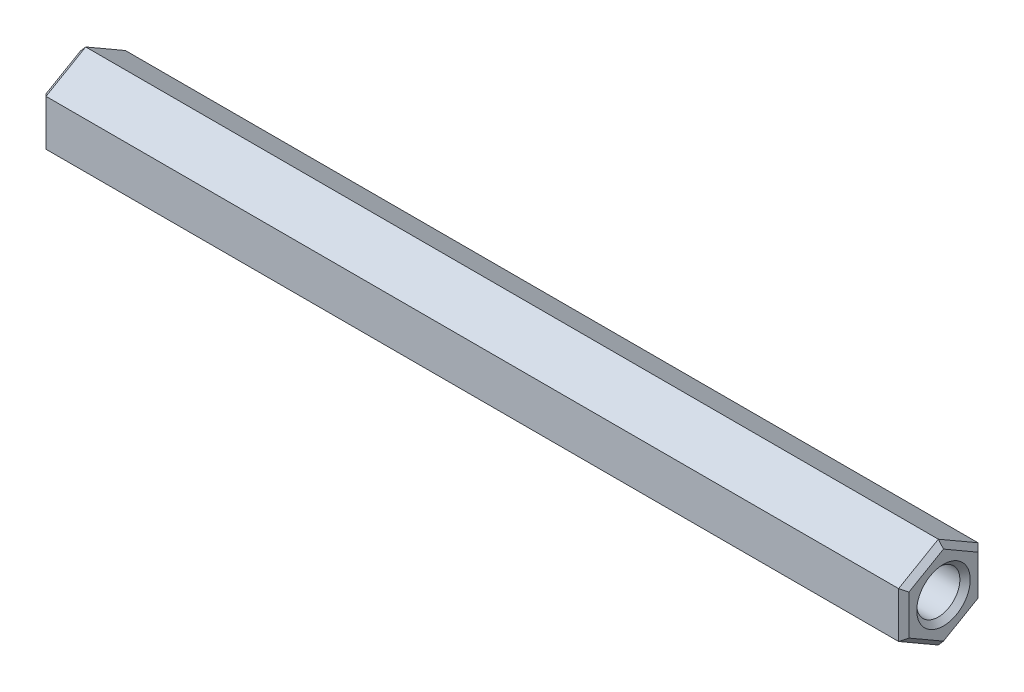
ISO-10303-21;
HEADER;
FILE_DESCRIPTION(('STEP AP214'),'2;1');
FILE_NAME('part.step','',(''),(''),'','','');
FILE_SCHEMA(('AUTOMOTIVE_DESIGN { 1 0 10303 214 1 1 1 1 }'));
ENDSEC;
DATA;
#1=APPLICATION_CONTEXT('core data for automotive mechanical design processes');
#2=APPLICATION_PROTOCOL_DEFINITION('international standard','automotive_design',2000,#1);
#3=PRODUCT_CONTEXT('',#1,'mechanical');
#4=PRODUCT('Part','Part','',(#3));
#5=PRODUCT_RELATED_PRODUCT_CATEGORY('part','',(#4));
#6=PRODUCT_DEFINITION_FORMATION('','',#4);
#7=PRODUCT_DEFINITION_CONTEXT('part definition',#1,'design');
#8=PRODUCT_DEFINITION('design','',#6,#7);
#9=PRODUCT_DEFINITION_SHAPE('','',#8);
#10=(LENGTH_UNIT() NAMED_UNIT(*) SI_UNIT(.MILLI.,.METRE.));
#11=(NAMED_UNIT(*) PLANE_ANGLE_UNIT() SI_UNIT($,.RADIAN.));
#12=(NAMED_UNIT(*) SI_UNIT($,.STERADIAN.) SOLID_ANGLE_UNIT());
#13=UNCERTAINTY_MEASURE_WITH_UNIT(LENGTH_MEASURE(1.E-05),#10,'distance_accuracy_value','');
#14=(GEOMETRIC_REPRESENTATION_CONTEXT(3) GLOBAL_UNCERTAINTY_ASSIGNED_CONTEXT((#13)) GLOBAL_UNIT_ASSIGNED_CONTEXT((#10,
#11,#12)) REPRESENTATION_CONTEXT('',''));
#15=CARTESIAN_POINT('',(0.,0.,0.));
#16=DIRECTION('',(0.,0.,1.));
#17=DIRECTION('',(1.,0.,0.));
#18=AXIS2_PLACEMENT_3D('',#15,#16,#17);
#19=CARTESIAN_POINT('',(50.,0.,0.));
#20=DIRECTION('',(1.,0.,0.));
#21=DIRECTION('',(0.,0.,-1.));
#22=AXIS2_PLACEMENT_3D('',#19,#20,#21);
#23=PLANE('',#22);
#24=CARTESIAN_POINT('',(50.,0.,0.));
#25=DIRECTION('',(1.,0.,0.));
#26=DIRECTION('',(0.,0.,-1.));
#27=AXIS2_PLACEMENT_3D('',#24,#25,#26);
#28=CIRCLE('',#27,1.55000000000001);
#29=CARTESIAN_POINT('',(50.,0.,-1.55000000000001));
#30=VERTEX_POINT('',#29);
#31=EDGE_CURVE('E11',#30,#30,#28,.F.);
#32=ORIENTED_EDGE('',*,*,#31,.T.);
#33=EDGE_LOOP('',(#32));
#34=FACE_BOUND('',#33,.T.);
#35=DIRECTION('',(0.,0.5,-0.866025403784439));
#36=VECTOR('',#35,1.);
#37=CARTESIAN_POINT('',(50.,-1.0680979980008,-2.14999999999999));
#38=LINE('',#37,#36);
#39=CARTESIAN_POINT('',(50.,-2.30940107675849,0.));
#40=VERTEX_POINT('',#39);
#41=CARTESIAN_POINT('',(50.,-1.15470053837924,-1.99999999999999));
#42=VERTEX_POINT('',#41);
#43=EDGE_CURVE('E61',#40,#42,#38,.T.);
#44=ORIENTED_EDGE('',*,*,#43,.T.);
#45=DIRECTION('',(0.,1.,0.));
#46=VECTOR('',#45,1.);
#47=CARTESIAN_POINT('',(50.,1.32790561913614,-1.99999999999999));
#48=LINE('',#47,#46);
#49=CARTESIAN_POINT('',(50.,1.15470053837925,-1.99999999999999));
#50=VERTEX_POINT('',#49);
#51=EDGE_CURVE('E53',#42,#50,#48,.T.);
#52=ORIENTED_EDGE('',*,*,#51,.T.);
#53=DIRECTION('',(0.,0.5,0.866025403784439));
#54=VECTOR('',#53,1.);
#55=CARTESIAN_POINT('',(50.,2.39600361713694,0.150000000000006));
#56=LINE('',#55,#54);
#57=CARTESIAN_POINT('',(50.,2.30940107675849,0.));
#58=VERTEX_POINT('',#57);
#59=EDGE_CURVE('E200',#50,#58,#56,.T.);
#60=ORIENTED_EDGE('',*,*,#59,.T.);
#61=DIRECTION('',(0.,-0.5,0.866025403784439));
#62=VECTOR('',#61,1.);
#63=CARTESIAN_POINT('',(50.,1.0680979980008,2.14999999999999));
#64=LINE('',#63,#62);
#65=CARTESIAN_POINT('',(50.,1.15470053837925,1.99999999999999));
#66=VERTEX_POINT('',#65);
#67=EDGE_CURVE('E202',#58,#66,#64,.T.);
#68=ORIENTED_EDGE('',*,*,#67,.T.);
#69=DIRECTION('',(0.,-1.,0.));
#70=VECTOR('',#69,1.);
#71=CARTESIAN_POINT('',(50.,-1.32790561913614,1.99999999999999));
#72=LINE('',#71,#70);
#73=CARTESIAN_POINT('',(50.,-1.15470053837925,1.99999999999999));
#74=VERTEX_POINT('',#73);
#75=EDGE_CURVE('E204',#66,#74,#72,.T.);
#76=ORIENTED_EDGE('',*,*,#75,.T.);
#77=DIRECTION('',(0.,-0.5,-0.866025403784439));
#78=VECTOR('',#77,1.);
#79=CARTESIAN_POINT('',(50.,-2.39600361713694,-0.150000000000004));
#80=LINE('',#79,#78);
#81=EDGE_CURVE('E66',#74,#40,#80,.T.);
#82=ORIENTED_EDGE('',*,*,#81,.T.);
#83=EDGE_LOOP('',(#44,#52,#60,#68,#76,#82));
#84=FACE_BOUND('',#83,.T.);
#85=ADVANCED_FACE('F43',(#34,#84),#23,.T.);
#86=CARTESIAN_POINT('',(0.,0.,0.));
#87=DIRECTION('',(1.,0.,0.));
#88=DIRECTION('',(0.,0.,-1.));
#89=AXIS2_PLACEMENT_3D('',#86,#87,#88);
#90=PLANE('',#89);
#91=CARTESIAN_POINT('',(0.,0.,0.));
#92=DIRECTION('',(1.,0.,0.));
#93=DIRECTION('',(0.,0.,-1.));
#94=AXIS2_PLACEMENT_3D('',#91,#92,#93);
#95=CIRCLE('',#94,1.55);
#96=CARTESIAN_POINT('',(0.,0.,-1.55));
#97=VERTEX_POINT('',#96);
#98=EDGE_CURVE('E162',#97,#97,#95,.T.);
#99=ORIENTED_EDGE('',*,*,#98,.T.);
#100=EDGE_LOOP('',(#99));
#101=FACE_BOUND('',#100,.T.);
#102=DIRECTION('',(0.,1.,0.));
#103=VECTOR('',#102,1.);
#104=CARTESIAN_POINT('',(0.,0.,2.00000000000001));
#105=LINE('',#104,#103);
#106=CARTESIAN_POINT('',(0.,-1.15470053837926,2.00000000000001));
#107=VERTEX_POINT('',#106);
#108=CARTESIAN_POINT('',(0.,1.15470053837926,2.00000000000001));
#109=VERTEX_POINT('',#108);
#110=EDGE_CURVE('E161',#107,#109,#105,.T.);
#111=ORIENTED_EDGE('',*,*,#110,.T.);
#112=DIRECTION('',(0.,0.5,-0.866025403784439));
#113=VECTOR('',#112,1.);
#114=CARTESIAN_POINT('',(0.,1.73205080756888,1.));
#115=LINE('',#114,#113);
#116=CARTESIAN_POINT('',(0.,2.30940107675851,0.));
#117=VERTEX_POINT('',#116);
#118=EDGE_CURVE('E140',#109,#117,#115,.T.);
#119=ORIENTED_EDGE('',*,*,#118,.T.);
#120=DIRECTION('',(0.,-0.5,-0.866025403784439));
#121=VECTOR('',#120,1.);
#122=CARTESIAN_POINT('',(0.,1.73205080756888,-1.));
#123=LINE('',#122,#121);
#124=CARTESIAN_POINT('',(0.,1.15470053837926,-2.00000000000001));
#125=VERTEX_POINT('',#124);
#126=EDGE_CURVE('E150',#117,#125,#123,.T.);
#127=ORIENTED_EDGE('',*,*,#126,.T.);
#128=DIRECTION('',(0.,-1.,0.));
#129=VECTOR('',#128,1.);
#130=CARTESIAN_POINT('',(0.,0.,-2.00000000000001));
#131=LINE('',#130,#129);
#132=CARTESIAN_POINT('',(0.,-1.15470053837925,-2.00000000000001));
#133=VERTEX_POINT('',#132);
#134=EDGE_CURVE('E156',#125,#133,#131,.T.);
#135=ORIENTED_EDGE('',*,*,#134,.T.);
#136=DIRECTION('',(0.,-0.5,0.866025403784439));
#137=VECTOR('',#136,1.);
#138=CARTESIAN_POINT('',(0.,-1.73205080756888,-1.));
#139=LINE('',#138,#137);
#140=CARTESIAN_POINT('',(0.,-2.30940107675851,0.));
#141=VERTEX_POINT('',#140);
#142=EDGE_CURVE('E262',#133,#141,#139,.T.);
#143=ORIENTED_EDGE('',*,*,#142,.T.);
#144=DIRECTION('',(0.,0.5,0.866025403784439));
#145=VECTOR('',#144,1.);
#146=CARTESIAN_POINT('',(0.,-1.73205080756888,1.));
#147=LINE('',#146,#145);
#148=EDGE_CURVE('E167',#141,#107,#147,.T.);
#149=ORIENTED_EDGE('',*,*,#148,.T.);
#150=EDGE_LOOP('',(#111,#119,#127,#135,#143,#149));
#151=FACE_BOUND('',#150,.T.);
#152=ADVANCED_FACE('F159',(#101,#151),#90,.F.);
#153=CARTESIAN_POINT('',(50.,1.32790561913614,-2.3));
#154=DIRECTION('',(0.,-0.866025403784439,0.5));
#155=DIRECTION('',(0.,-0.5,-0.866025403784439));
#156=AXIS2_PLACEMENT_3D('',#153,#154,#155);
#157=PLANE('',#156);
#158=DIRECTION('',(-1.,0.,0.));
#159=VECTOR('',#158,1.);
#160=CARTESIAN_POINT('',(50.,1.32790561913614,-2.3));
#161=LINE('',#160,#159);
#162=CARTESIAN_POINT('',(49.7,1.32790561913614,-2.3));
#163=VERTEX_POINT('',#162);
#164=CARTESIAN_POINT('',(0.299999999999988,1.32790561913614,-2.3));
#165=VERTEX_POINT('',#164);
#166=EDGE_CURVE('E219',#163,#165,#161,.T.);
#167=ORIENTED_EDGE('',*,*,#166,.T.);
#168=DIRECTION('',(0.,0.5,0.866025403784439));
#169=VECTOR('',#168,1.);
#170=CARTESIAN_POINT('',(0.299999999999988,1.32790561913614,-2.3));
#171=LINE('',#170,#169);
#172=CARTESIAN_POINT('',(0.299999999999988,2.65581123827228,0.));
#173=VERTEX_POINT('',#172);
#174=EDGE_CURVE('E198',#165,#173,#171,.T.);
#175=ORIENTED_EDGE('',*,*,#174,.T.);
#176=DIRECTION('',(-1.,0.,0.));
#177=VECTOR('',#176,1.);
#178=CARTESIAN_POINT('',(50.,2.65581123827228,0.));
#179=LINE('',#178,#177);
#180=CARTESIAN_POINT('',(49.7,2.65581123827228,0.));
#181=VERTEX_POINT('',#180);
#182=EDGE_CURVE('E157',#181,#173,#179,.T.);
#183=ORIENTED_EDGE('',*,*,#182,.F.);
#184=DIRECTION('',(0.,-0.5,-0.866025403784439));
#185=VECTOR('',#184,1.);
#186=CARTESIAN_POINT('',(49.7,1.32790561913614,-2.3));
#187=LINE('',#186,#185);
#188=EDGE_CURVE('E196',#181,#163,#187,.T.);
#189=ORIENTED_EDGE('',*,*,#188,.T.);
#190=EDGE_LOOP('',(#167,#175,#183,#189));
#191=FACE_BOUND('',#190,.T.);
#192=ADVANCED_FACE('F286',(#191),#157,.F.);
#193=CARTESIAN_POINT('',(50.,2.65581123827228,0.));
#194=DIRECTION('',(0.,-0.866025403784438,-0.5));
#195=DIRECTION('',(0.,0.5,-0.866025403784438));
#196=AXIS2_PLACEMENT_3D('',#193,#194,#195);
#197=PLANE('',#196);
#198=ORIENTED_EDGE('',*,*,#182,.T.);
#199=DIRECTION('',(0.,-0.5,0.866025403784438));
#200=VECTOR('',#199,1.);
#201=CARTESIAN_POINT('',(0.299999999999988,2.65581123827228,0.));
#202=LINE('',#201,#200);
#203=CARTESIAN_POINT('',(0.299999999999988,1.32790561913614,2.3));
#204=VERTEX_POINT('',#203);
#205=EDGE_CURVE('E143',#173,#204,#202,.T.);
#206=ORIENTED_EDGE('',*,*,#205,.T.);
#207=DIRECTION('',(-1.,0.,0.));
#208=VECTOR('',#207,1.);
#209=CARTESIAN_POINT('',(50.,1.32790561913614,2.3));
#210=LINE('',#209,#208);
#211=CARTESIAN_POINT('',(49.7,1.32790561913614,2.3));
#212=VERTEX_POINT('',#211);
#213=EDGE_CURVE('E248',#212,#204,#210,.T.);
#214=ORIENTED_EDGE('',*,*,#213,.F.);
#215=DIRECTION('',(0.,0.5,-0.866025403784438));
#216=VECTOR('',#215,1.);
#217=CARTESIAN_POINT('',(49.7,2.65581123827228,0.));
#218=LINE('',#217,#216);
#219=EDGE_CURVE('E176',#212,#181,#218,.T.);
#220=ORIENTED_EDGE('',*,*,#219,.T.);
#221=EDGE_LOOP('',(#198,#206,#214,#220));
#222=FACE_BOUND('',#221,.T.);
#223=ADVANCED_FACE('F253',(#222),#197,.F.);
#224=CARTESIAN_POINT('',(50.,1.32790561913614,2.3));
#225=DIRECTION('',(0.,0.,-1.));
#226=DIRECTION('',(0.,1.,0.));
#227=AXIS2_PLACEMENT_3D('',#224,#225,#226);
#228=PLANE('',#227);
#229=ORIENTED_EDGE('',*,*,#213,.T.);
#230=DIRECTION('',(0.,-1.,0.));
#231=VECTOR('',#230,1.);
#232=CARTESIAN_POINT('',(0.299999999999988,1.32790561913614,2.3));
#233=LINE('',#232,#231);
#234=CARTESIAN_POINT('',(0.299999999999988,-1.32790561913614,2.3));
#235=VERTEX_POINT('',#234);
#236=EDGE_CURVE('E181',#204,#235,#233,.T.);
#237=ORIENTED_EDGE('',*,*,#236,.T.);
#238=DIRECTION('',(-1.,0.,0.));
#239=VECTOR('',#238,1.);
#240=CARTESIAN_POINT('',(50.,-1.32790561913614,2.3));
#241=LINE('',#240,#239);
#242=CARTESIAN_POINT('',(49.7,-1.32790561913614,2.3));
#243=VERTEX_POINT('',#242);
#244=EDGE_CURVE('E250',#243,#235,#241,.T.);
#245=ORIENTED_EDGE('',*,*,#244,.F.);
#246=DIRECTION('',(0.,1.,0.));
#247=VECTOR('',#246,1.);
#248=CARTESIAN_POINT('',(49.7,1.32790561913614,2.3));
#249=LINE('',#248,#247);
#250=EDGE_CURVE('E179',#243,#212,#249,.T.);
#251=ORIENTED_EDGE('',*,*,#250,.T.);
#252=EDGE_LOOP('',(#229,#237,#245,#251));
#253=FACE_BOUND('',#252,.T.);
#254=ADVANCED_FACE('F247',(#253),#228,.F.);
#255=CARTESIAN_POINT('',(50.,-1.32790561913614,2.3));
#256=DIRECTION('',(0.,0.866025403784438,-0.5));
#257=DIRECTION('',(0.,0.5,0.866025403784439));
#258=AXIS2_PLACEMENT_3D('',#255,#256,#257);
#259=PLANE('',#258);
#260=ORIENTED_EDGE('',*,*,#244,.T.);
#261=DIRECTION('',(0.,-0.5,-0.866025403784439));
#262=VECTOR('',#261,1.);
#263=CARTESIAN_POINT('',(0.299999999999988,-1.32790561913614,2.3));
#264=LINE('',#263,#262);
#265=CARTESIAN_POINT('',(0.299999999999988,-2.65581123827228,0.));
#266=VERTEX_POINT('',#265);
#267=EDGE_CURVE('E185',#235,#266,#264,.T.);
#268=ORIENTED_EDGE('',*,*,#267,.T.);
#269=DIRECTION('',(-1.,0.,0.));
#270=VECTOR('',#269,1.);
#271=CARTESIAN_POINT('',(50.,-2.65581123827228,0.));
#272=LINE('',#271,#270);
#273=CARTESIAN_POINT('',(49.7,-2.65581123827228,0.));
#274=VERTEX_POINT('',#273);
#275=EDGE_CURVE('E257',#274,#266,#272,.T.);
#276=ORIENTED_EDGE('',*,*,#275,.F.);
#277=DIRECTION('',(0.,0.5,0.866025403784439));
#278=VECTOR('',#277,1.);
#279=CARTESIAN_POINT('',(49.7,-1.32790561913614,2.3));
#280=LINE('',#279,#278);
#281=EDGE_CURVE('E183',#274,#243,#280,.T.);
#282=ORIENTED_EDGE('',*,*,#281,.T.);
#283=EDGE_LOOP('',(#260,#268,#276,#282));
#284=FACE_BOUND('',#283,.T.);
#285=ADVANCED_FACE('F274',(#284),#259,.F.);
#286=CARTESIAN_POINT('',(50.,-2.65581123827228,0.));
#287=DIRECTION('',(0.,0.866025403784439,0.5));
#288=DIRECTION('',(0.,-0.5,0.866025403784439));
#289=AXIS2_PLACEMENT_3D('',#286,#287,#288);
#290=PLANE('',#289);
#291=ORIENTED_EDGE('',*,*,#275,.T.);
#292=DIRECTION('',(0.,0.5,-0.866025403784439));
#293=VECTOR('',#292,1.);
#294=CARTESIAN_POINT('',(0.299999999999988,-2.65581123827228,0.));
#295=LINE('',#294,#293);
#296=CARTESIAN_POINT('',(0.299999999999988,-1.32790561913614,-2.3));
#297=VERTEX_POINT('',#296);
#298=EDGE_CURVE('E189',#266,#297,#295,.T.);
#299=ORIENTED_EDGE('',*,*,#298,.T.);
#300=DIRECTION('',(-1.,0.,0.));
#301=VECTOR('',#300,1.);
#302=CARTESIAN_POINT('',(50.,-1.32790561913614,-2.3));
#303=LINE('',#302,#301);
#304=CARTESIAN_POINT('',(49.7,-1.32790561913614,-2.3));
#305=VERTEX_POINT('',#304);
#306=EDGE_CURVE('E279',#305,#297,#303,.T.);
#307=ORIENTED_EDGE('',*,*,#306,.F.);
#308=DIRECTION('',(0.,-0.5,0.866025403784439));
#309=VECTOR('',#308,1.);
#310=CARTESIAN_POINT('',(49.7,-2.65581123827228,0.));
#311=LINE('',#310,#309);
#312=EDGE_CURVE('E187',#305,#274,#311,.T.);
#313=ORIENTED_EDGE('',*,*,#312,.T.);
#314=EDGE_LOOP('',(#291,#299,#307,#313));
#315=FACE_BOUND('',#314,.T.);
#316=ADVANCED_FACE('F297',(#315),#290,.F.);
#317=CARTESIAN_POINT('',(50.,-1.32790561913614,-2.3));
#318=DIRECTION('',(0.,0.,1.));
#319=DIRECTION('',(1.,0.,0.));
#320=AXIS2_PLACEMENT_3D('',#317,#318,#319);
#321=PLANE('',#320);
#322=ORIENTED_EDGE('',*,*,#306,.T.);
#323=DIRECTION('',(0.,1.,0.));
#324=VECTOR('',#323,1.);
#325=CARTESIAN_POINT('',(0.299999999999988,-1.32790561913614,-2.3));
#326=LINE('',#325,#324);
#327=EDGE_CURVE('E194',#297,#165,#326,.T.);
#328=ORIENTED_EDGE('',*,*,#327,.T.);
#329=ORIENTED_EDGE('',*,*,#166,.F.);
#330=DIRECTION('',(0.,-1.,0.));
#331=VECTOR('',#330,1.);
#332=CARTESIAN_POINT('',(49.7,-1.32790561913614,-2.3));
#333=LINE('',#332,#331);
#334=EDGE_CURVE('E191',#163,#305,#333,.T.);
#335=ORIENTED_EDGE('',*,*,#334,.T.);
#336=EDGE_LOOP('',(#322,#328,#329,#335));
#337=FACE_BOUND('',#336,.T.);
#338=ADVANCED_FACE('F298',(#337),#321,.F.);
#339=CARTESIAN_POINT('',(50.,0.,0.));
#340=DIRECTION('',(-1.,0.,0.));
#341=DIRECTION('',(0.,0.,1.));
#342=AXIS2_PLACEMENT_3D('',#339,#340,#341);
#343=CYLINDRICAL_SURFACE('',#342,1.25);
#344=CARTESIAN_POINT('',(0.299999999999995,0.,0.));
#345=DIRECTION('',(1.,0.,0.));
#346=DIRECTION('',(0.,0.,-1.));
#347=AXIS2_PLACEMENT_3D('',#344,#345,#346);
#348=CIRCLE('',#347,1.25);
#349=CARTESIAN_POINT('',(0.299999999999995,0.,-1.25));
#350=VERTEX_POINT('',#349);
#351=EDGE_CURVE('E173',#350,#350,#348,.F.);
#352=ORIENTED_EDGE('',*,*,#351,.T.);
#353=EDGE_LOOP('',(#352));
#354=FACE_BOUND('',#353,.T.);
#355=CARTESIAN_POINT('',(49.7,0.,0.));
#356=DIRECTION('',(1.,0.,0.));
#357=DIRECTION('',(0.,0.,-1.));
#358=AXIS2_PLACEMENT_3D('',#355,#356,#357);
#359=CIRCLE('',#358,1.25);
#360=CARTESIAN_POINT('',(49.7,0.,-1.25));
#361=VERTEX_POINT('',#360);
#362=EDGE_CURVE('E165',#361,#361,#359,.T.);
#363=ORIENTED_EDGE('',*,*,#362,.T.);
#364=EDGE_LOOP('',(#363));
#365=FACE_BOUND('',#364,.T.);
#366=ADVANCED_FACE('F317',(#354,#365),#343,.F.);
#367=CARTESIAN_POINT('',(0.,0.,0.));
#368=DIRECTION('',(-1.,0.,0.));
#369=DIRECTION('',(0.,0.,1.));
#370=AXIS2_PLACEMENT_3D('',#367,#368,#369);
#371=CONICAL_SURFACE('',#370,1.55,0.785398163397462);
#372=ORIENTED_EDGE('',*,*,#351,.F.);
#373=EDGE_LOOP('',(#372));
#374=FACE_BOUND('',#373,.T.);
#375=ORIENTED_EDGE('',*,*,#98,.F.);
#376=EDGE_LOOP('',(#375));
#377=FACE_BOUND('',#376,.T.);
#378=ADVANCED_FACE('F332',(#374,#377),#371,.F.);
#379=CARTESIAN_POINT('',(0.299999999999988,-2.65581123827228,0.));
#380=DIRECTION('',(0.707106781186553,0.61237243569579,0.353553390593271));
#381=DIRECTION('',(0.,0.5,-0.866025403784439));
#382=AXIS2_PLACEMENT_3D('',#379,#380,#381);
#383=PLANE('',#382);
#384=DIRECTION('',(-0.654653670707971,0.75592894601846,0.));
#385=VECTOR('',#384,1.);
#386=CARTESIAN_POINT('',(0.299999999999988,-2.65581123827228,0.));
#387=LINE('',#386,#385);
#388=EDGE_CURVE('E213',#141,#266,#387,.F.);
#389=ORIENTED_EDGE('',*,*,#388,.F.);
#390=ORIENTED_EDGE('',*,*,#142,.F.);
#391=DIRECTION('',(-0.654653670707971,0.37796447300923,0.654653670707982));
#392=VECTOR('',#391,1.);
#393=CARTESIAN_POINT('',(0.299999999999988,-1.32790561913614,-2.3));
#394=LINE('',#393,#392);
#395=EDGE_CURVE('E216',#297,#133,#394,.T.);
#396=ORIENTED_EDGE('',*,*,#395,.F.);
#397=ORIENTED_EDGE('',*,*,#298,.F.);
#398=EDGE_LOOP('',(#389,#390,#396,#397));
#399=FACE_BOUND('',#398,.T.);
#400=ADVANCED_FACE('F295',(#399),#383,.F.);
#401=CARTESIAN_POINT('',(0.299999999999988,-1.32790561913614,-2.3));
#402=DIRECTION('',(0.707106781186553,0.,0.707106781186542));
#403=DIRECTION('',(0.,1.,0.));
#404=AXIS2_PLACEMENT_3D('',#401,#402,#403);
#405=PLANE('',#404);
#406=ORIENTED_EDGE('',*,*,#395,.T.);
#407=ORIENTED_EDGE('',*,*,#134,.F.);
#408=DIRECTION('',(-0.654653670707971,-0.377964473009231,0.654653670707981));
#409=VECTOR('',#408,1.);
#410=CARTESIAN_POINT('',(0.299999999999988,1.32790561913614,-2.3));
#411=LINE('',#410,#409);
#412=EDGE_CURVE('E153',#165,#125,#411,.T.);
#413=ORIENTED_EDGE('',*,*,#412,.F.);
#414=ORIENTED_EDGE('',*,*,#327,.F.);
#415=EDGE_LOOP('',(#406,#407,#413,#414));
#416=FACE_BOUND('',#415,.T.);
#417=ADVANCED_FACE('F292',(#416),#405,.F.);
#418=CARTESIAN_POINT('',(0.299999999999988,-1.32790561913614,2.3));
#419=DIRECTION('',(0.707106781186553,0.61237243569579,-0.353553390593271));
#420=DIRECTION('',(0.,-0.5,-0.866025403784439));
#421=AXIS2_PLACEMENT_3D('',#418,#419,#420);
#422=PLANE('',#421);
#423=ORIENTED_EDGE('',*,*,#388,.T.);
#424=ORIENTED_EDGE('',*,*,#267,.F.);
#425=DIRECTION('',(-0.654653670707971,0.377964473009229,-0.654653670707982));
#426=VECTOR('',#425,1.);
#427=CARTESIAN_POINT('',(0.299999999999988,-1.32790561913614,2.3));
#428=LINE('',#427,#426);
#429=EDGE_CURVE('E146',#107,#235,#428,.F.);
#430=ORIENTED_EDGE('',*,*,#429,.F.);
#431=ORIENTED_EDGE('',*,*,#148,.F.);
#432=EDGE_LOOP('',(#423,#424,#430,#431));
#433=FACE_BOUND('',#432,.T.);
#434=ADVANCED_FACE('F269',(#433),#422,.F.);
#435=CARTESIAN_POINT('',(0.299999999999988,1.32790561913614,-2.3));
#436=DIRECTION('',(0.707106781186554,-0.612372435695789,0.353553390593271));
#437=DIRECTION('',(0.,0.5,0.866025403784439));
#438=AXIS2_PLACEMENT_3D('',#435,#436,#437);
#439=PLANE('',#438);
#440=ORIENTED_EDGE('',*,*,#412,.T.);
#441=ORIENTED_EDGE('',*,*,#126,.F.);
#442=DIRECTION('',(0.654653670707971,0.75592894601846,0.));
#443=VECTOR('',#442,1.);
#444=CARTESIAN_POINT('',(-0.357142857142868,1.89700802733733,0.));
#445=LINE('',#444,#443);
#446=EDGE_CURVE('E136',#173,#117,#445,.F.);
#447=ORIENTED_EDGE('',*,*,#446,.F.);
#448=ORIENTED_EDGE('',*,*,#174,.F.);
#449=EDGE_LOOP('',(#440,#441,#447,#448));
#450=FACE_BOUND('',#449,.T.);
#451=ADVANCED_FACE('F151',(#450),#439,.F.);
#452=CARTESIAN_POINT('',(0.299999999999988,1.32790561913614,2.3));
#453=DIRECTION('',(0.707106781186553,0.,-0.707106781186542));
#454=DIRECTION('',(0.,-1.,0.));
#455=AXIS2_PLACEMENT_3D('',#452,#453,#454);
#456=PLANE('',#455);
#457=ORIENTED_EDGE('',*,*,#429,.T.);
#458=ORIENTED_EDGE('',*,*,#236,.F.);
#459=DIRECTION('',(-0.654653670707971,-0.37796447300923,-0.654653670707982));
#460=VECTOR('',#459,1.);
#461=CARTESIAN_POINT('',(0.299999999999988,1.32790561913614,2.3));
#462=LINE('',#461,#460);
#463=EDGE_CURVE('E147',#109,#204,#462,.F.);
#464=ORIENTED_EDGE('',*,*,#463,.F.);
#465=ORIENTED_EDGE('',*,*,#110,.F.);
#466=EDGE_LOOP('',(#457,#458,#464,#465));
#467=FACE_BOUND('',#466,.T.);
#468=ADVANCED_FACE('F272',(#467),#456,.F.);
#469=CARTESIAN_POINT('',(0.299999999999988,2.65581123827228,0.));
#470=DIRECTION('',(0.707106781186554,-0.612372435695789,-0.353553390593271));
#471=DIRECTION('',(0.,-0.5,0.866025403784438));
#472=AXIS2_PLACEMENT_3D('',#469,#470,#471);
#473=PLANE('',#472);
#474=ORIENTED_EDGE('',*,*,#446,.T.);
#475=ORIENTED_EDGE('',*,*,#118,.F.);
#476=ORIENTED_EDGE('',*,*,#463,.T.);
#477=ORIENTED_EDGE('',*,*,#205,.F.);
#478=EDGE_LOOP('',(#474,#475,#476,#477));
#479=FACE_BOUND('',#478,.T.);
#480=ADVANCED_FACE('F138',(#479),#473,.F.);
#481=CARTESIAN_POINT('',(49.7,0.,0.));
#482=DIRECTION('',(1.,0.,0.));
#483=DIRECTION('',(0.,0.,-1.));
#484=AXIS2_PLACEMENT_3D('',#481,#482,#483);
#485=CONICAL_SURFACE('',#484,1.25,0.785398163397439);
#486=ORIENTED_EDGE('',*,*,#31,.F.);
#487=EDGE_LOOP('',(#486));
#488=FACE_BOUND('',#487,.T.);
#489=ORIENTED_EDGE('',*,*,#362,.F.);
#490=EDGE_LOOP('',(#489));
#491=FACE_BOUND('',#490,.T.);
#492=ADVANCED_FACE('F346',(#488,#491),#485,.F.);
#493=CARTESIAN_POINT('',(50.,0.,1.99999999999999));
#494=DIRECTION('',(0.707106781186542,0.,0.707106781186553));
#495=DIRECTION('',(0.,1.,0.));
#496=AXIS2_PLACEMENT_3D('',#493,#494,#495);
#497=PLANE('',#496);
#498=DIRECTION('',(0.654653670707983,-0.377964473009224,-0.654653670707973));
#499=VECTOR('',#498,1.);
#500=CARTESIAN_POINT('',(50.2857142857143,0.989743318610784,1.71428571428571));
#501=LINE('',#500,#499);
#502=EDGE_CURVE('E229',#212,#66,#501,.T.);
#503=ORIENTED_EDGE('',*,*,#502,.F.);
#504=ORIENTED_EDGE('',*,*,#250,.F.);
#505=DIRECTION('',(0.654653670707983,0.377964473009225,-0.654653670707973));
#506=VECTOR('',#505,1.);
#507=CARTESIAN_POINT('',(50.2857142857143,-0.989743318610784,1.71428571428571));
#508=LINE('',#507,#506);
#509=EDGE_CURVE('E48',#74,#243,#508,.F.);
#510=ORIENTED_EDGE('',*,*,#509,.F.);
#511=ORIENTED_EDGE('',*,*,#75,.F.);
#512=EDGE_LOOP('',(#503,#504,#510,#511));
#513=FACE_BOUND('',#512,.T.);
#514=ADVANCED_FACE('F46',(#513),#497,.T.);
#515=CARTESIAN_POINT('',(50.,-1.73205080756887,0.999999999999995));
#516=DIRECTION('',(0.707106781186542,-0.612372435695799,0.353553390593277));
#517=DIRECTION('',(0.,0.5,0.866025403784439));
#518=AXIS2_PLACEMENT_3D('',#515,#516,#517);
#519=PLANE('',#518);
#520=ORIENTED_EDGE('',*,*,#509,.T.);
#521=ORIENTED_EDGE('',*,*,#281,.F.);
#522=DIRECTION('',(0.654653670707983,0.75592894601845,0.));
#523=VECTOR('',#522,1.);
#524=CARTESIAN_POINT('',(50.2857142857143,-1.97948663722157,0.));
#525=LINE('',#524,#523);
#526=EDGE_CURVE('E227',#40,#274,#525,.F.);
#527=ORIENTED_EDGE('',*,*,#526,.F.);
#528=ORIENTED_EDGE('',*,*,#81,.F.);
#529=EDGE_LOOP('',(#520,#521,#527,#528));
#530=FACE_BOUND('',#529,.T.);
#531=ADVANCED_FACE('F239',(#530),#519,.T.);
#532=CARTESIAN_POINT('',(50.,1.73205080756887,0.999999999999995));
#533=DIRECTION('',(0.707106781186542,0.612372435695799,0.353553390593277));
#534=DIRECTION('',(0.,0.5,-0.866025403784438));
#535=AXIS2_PLACEMENT_3D('',#532,#533,#534);
#536=PLANE('',#535);
#537=ORIENTED_EDGE('',*,*,#502,.T.);
#538=ORIENTED_EDGE('',*,*,#67,.F.);
#539=DIRECTION('',(0.654653670707983,-0.75592894601845,0.));
#540=VECTOR('',#539,1.);
#541=CARTESIAN_POINT('',(50.2857142857143,1.97948663722157,0.));
#542=LINE('',#541,#540);
#543=EDGE_CURVE('E224',#181,#58,#542,.T.);
#544=ORIENTED_EDGE('',*,*,#543,.F.);
#545=ORIENTED_EDGE('',*,*,#219,.F.);
#546=EDGE_LOOP('',(#537,#538,#544,#545));
#547=FACE_BOUND('',#546,.T.);
#548=ADVANCED_FACE('F392',(#547),#536,.T.);
#549=CARTESIAN_POINT('',(50.,-1.73205080756887,-0.999999999999994));
#550=DIRECTION('',(0.707106781186542,-0.612372435695799,-0.353553390593276));
#551=DIRECTION('',(0.,-0.5,0.866025403784439));
#552=AXIS2_PLACEMENT_3D('',#549,#550,#551);
#553=PLANE('',#552);
#554=ORIENTED_EDGE('',*,*,#526,.T.);
#555=ORIENTED_EDGE('',*,*,#312,.F.);
#556=DIRECTION('',(0.654653670707983,0.377964473009224,0.654653670707973));
#557=VECTOR('',#556,1.);
#558=CARTESIAN_POINT('',(50.2857142857143,-0.989743318610783,-1.71428571428571));
#559=LINE('',#558,#557);
#560=EDGE_CURVE('E222',#42,#305,#559,.F.);
#561=ORIENTED_EDGE('',*,*,#560,.F.);
#562=ORIENTED_EDGE('',*,*,#43,.F.);
#563=EDGE_LOOP('',(#554,#555,#561,#562));
#564=FACE_BOUND('',#563,.T.);
#565=ADVANCED_FACE('F386',(#564),#553,.T.);
#566=CARTESIAN_POINT('',(50.,1.73205080756887,-0.999999999999994));
#567=DIRECTION('',(0.707106781186543,0.612372435695799,-0.353553390593276));
#568=DIRECTION('',(0.,-0.5,-0.866025403784439));
#569=AXIS2_PLACEMENT_3D('',#566,#567,#568);
#570=PLANE('',#569);
#571=ORIENTED_EDGE('',*,*,#543,.T.);
#572=ORIENTED_EDGE('',*,*,#59,.F.);
#573=DIRECTION('',(-0.654653670707982,0.377964473009225,-0.654653670707973));
#574=VECTOR('',#573,1.);
#575=CARTESIAN_POINT('',(50.2857142857143,0.989743318610784,-1.71428571428571));
#576=LINE('',#575,#574);
#577=EDGE_CURVE('E220',#163,#50,#576,.F.);
#578=ORIENTED_EDGE('',*,*,#577,.F.);
#579=ORIENTED_EDGE('',*,*,#188,.F.);
#580=EDGE_LOOP('',(#571,#572,#578,#579));
#581=FACE_BOUND('',#580,.T.);
#582=ADVANCED_FACE('F306',(#581),#570,.T.);
#583=CARTESIAN_POINT('',(50.,0.,-1.99999999999999));
#584=DIRECTION('',(0.707106781186542,0.,-0.707106781186553));
#585=DIRECTION('',(0.,-1.,0.));
#586=AXIS2_PLACEMENT_3D('',#583,#584,#585);
#587=PLANE('',#586);
#588=ORIENTED_EDGE('',*,*,#560,.T.);
#589=ORIENTED_EDGE('',*,*,#334,.F.);
#590=ORIENTED_EDGE('',*,*,#577,.T.);
#591=ORIENTED_EDGE('',*,*,#51,.F.);
#592=EDGE_LOOP('',(#588,#589,#590,#591));
#593=FACE_BOUND('',#592,.T.);
#594=ADVANCED_FACE('F301',(#593),#587,.T.);
#595=CLOSED_SHELL('',(#85,#152,#192,#223,#254,#285,#316,#338,#366,#378,#400,#417,#434,#451,#468,
#480,#492,#514,#531,#548,#565,#582,#594));
#596=MANIFOLD_SOLID_BREP('B2',#595);
#597=ADVANCED_BREP_SHAPE_REPRESENTATION('',(#18,#596),#14);
#598=SHAPE_DEFINITION_REPRESENTATION(#9,#597);
ENDSEC;
END-ISO-10303-21;
